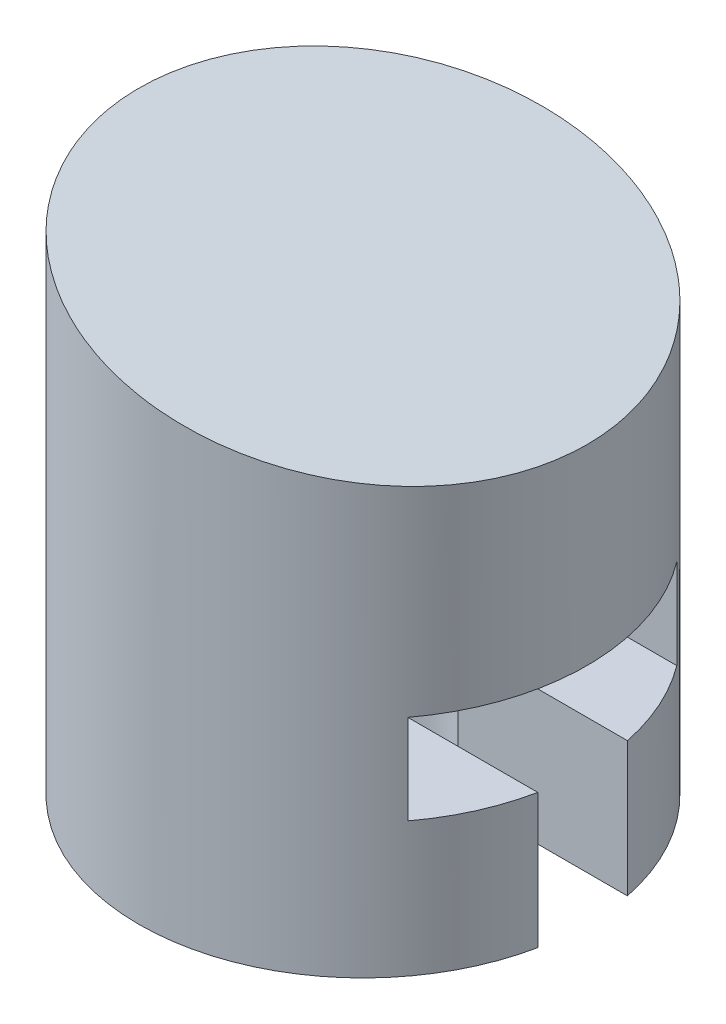
ISO-10303-21;
HEADER;
FILE_DESCRIPTION(('STEP AP214'),'2;1');
FILE_NAME('part.step','',(''),(''),'','','');
FILE_SCHEMA(('AUTOMOTIVE_DESIGN { 1 0 10303 214 1 1 1 1 }'));
ENDSEC;
DATA;
#1=APPLICATION_CONTEXT('core data for automotive mechanical design processes');
#2=APPLICATION_PROTOCOL_DEFINITION('international standard','automotive_design',2000,#1);
#3=PRODUCT_CONTEXT('',#1,'mechanical');
#4=PRODUCT('Part','Part','',(#3));
#5=PRODUCT_RELATED_PRODUCT_CATEGORY('part','',(#4));
#6=PRODUCT_DEFINITION_FORMATION('','',#4);
#7=PRODUCT_DEFINITION_CONTEXT('part definition',#1,'design');
#8=PRODUCT_DEFINITION('design','',#6,#7);
#9=PRODUCT_DEFINITION_SHAPE('','',#8);
#10=(LENGTH_UNIT() NAMED_UNIT(*) SI_UNIT(.MILLI.,.METRE.));
#11=(NAMED_UNIT(*) PLANE_ANGLE_UNIT() SI_UNIT($,.RADIAN.));
#12=(NAMED_UNIT(*) SI_UNIT($,.STERADIAN.) SOLID_ANGLE_UNIT());
#13=UNCERTAINTY_MEASURE_WITH_UNIT(LENGTH_MEASURE(1.E-05),#10,'distance_accuracy_value','');
#14=(GEOMETRIC_REPRESENTATION_CONTEXT(3) GLOBAL_UNCERTAINTY_ASSIGNED_CONTEXT((#13)) GLOBAL_UNIT_ASSIGNED_CONTEXT((#10,
#11,#12)) REPRESENTATION_CONTEXT('',''));
#15=CARTESIAN_POINT('',(0.,0.,0.));
#16=DIRECTION('',(0.,0.,1.));
#17=DIRECTION('',(1.,0.,0.));
#18=AXIS2_PLACEMENT_3D('',#15,#16,#17);
#19=CARTESIAN_POINT('',(62.0070472276326,-3.44598031444264,12.));
#20=DIRECTION('',(0.,1.,0.));
#21=DIRECTION('',(0.,0.,1.));
#22=AXIS2_PLACEMENT_3D('',#19,#20,#21);
#23=CYLINDRICAL_SURFACE('',#22,5.);
#24=CARTESIAN_POINT('',(62.0070472276326,7.22168747182208,17.));
#25=CARTESIAN_POINT('',(61.722556401128,7.27549301161385,16.999988009845));
#26=CARTESIAN_POINT('',(61.4378477151399,7.32927000221098,16.9756453702141));
#27=CARTESIAN_POINT('',(60.8761757344202,7.43520657111893,16.8787830196138));
#28=CARTESIAN_POINT('',(60.5992221817849,7.48736412329567,16.8062053163252));
#29=CARTESIAN_POINT('',(60.0612117571986,7.58853094617125,16.614673684515));
#30=CARTESIAN_POINT('',(59.8001535953893,7.63754047233974,16.4957235247786));
#31=CARTESIAN_POINT('',(59.3016427695895,7.73097156765177,16.2145765548463));
#32=CARTESIAN_POINT('',(59.0641833717945,7.77539444571704,16.0523921302819));
#33=CARTESIAN_POINT('',(58.6217928635087,7.85800868012542,15.6906644761985));
#34=CARTESIAN_POINT('',(58.4166062974767,7.89624904939597,15.4914450626635));
#35=CARTESIAN_POINT('',(58.0426780649608,7.96582287314903,15.0602603995023));
#36=CARTESIAN_POINT('',(57.8739347090468,7.99715664780803,14.8282966686581));
#37=CARTESIAN_POINT('',(57.5806952801721,8.05153327304607,14.342350333871));
#38=CARTESIAN_POINT('',(57.4555100819384,8.07470532863429,14.0887980242486));
#39=CARTESIAN_POINT('',(57.2494874117985,8.11280492796251,13.5636961598051));
#40=CARTESIAN_POINT('',(57.1686457716149,8.12773324661153,13.2921482992494));
#41=CARTESIAN_POINT('',(57.0547439543211,8.14875785106615,12.7430710802692));
#42=CARTESIAN_POINT('',(57.0209970580382,8.15498107476328,12.4656888829542));
#43=CARTESIAN_POINT('',(57.0001240707622,8.15883084846806,11.9091232001494));
#44=CARTESIAN_POINT('',(57.0129954923924,8.15645785713717,11.6299398115579));
#45=CARTESIAN_POINT('',(57.0847024461556,8.14322831583591,11.0796790210209));
#46=CARTESIAN_POINT('',(57.1432268745309,8.13242918591193,10.8085595995688));
#47=CARTESIAN_POINT('',(57.3040429934969,8.10271885608204,10.2801061157671));
#48=CARTESIAN_POINT('',(57.4063348859844,8.08380761875541,10.0227721170151));
#49=CARTESIAN_POINT('',(57.6520197536033,8.03831372146541,9.52810152041983));
#50=CARTESIAN_POINT('',(57.7955620271356,8.01170319286196,9.29084168965339));
#51=CARTESIAN_POINT('',(58.1192962643885,7.95157598575595,8.8438046496195));
#52=CARTESIAN_POINT('',(58.2994902266789,7.91805893064807,8.63402894005194));
#53=CARTESIAN_POINT('',(58.6937637868715,7.8445785418436,8.24502930987128));
#54=CARTESIAN_POINT('',(58.9082414962276,7.8045393520109,8.0662233527594));
#55=CARTESIAN_POINT('',(59.3632251224324,7.71943903234462,7.74706634739932));
#56=CARTESIAN_POINT('',(59.6037332737648,7.67437747137491,7.60671860410732));
#57=CARTESIAN_POINT('',(60.108229383818,7.57969691036311,7.3660070019238));
#58=CARTESIAN_POINT('',(60.3725413527198,7.53001457129355,7.26634704831786));
#59=CARTESIAN_POINT('',(60.9137011233393,7.42813464052047,7.11290331445019));
#60=CARTESIAN_POINT('',(61.1905499522506,7.37593684269306,7.05912330049818));
#61=CARTESIAN_POINT('',(61.7529822668014,7.26974465464294,6.99834628433633));
#62=CARTESIAN_POINT('',(62.0386334525063,7.21573544905748,6.99200017848744));
#63=CARTESIAN_POINT('',(62.6069491458097,7.10815053950076,7.02795860286933));
#64=CARTESIAN_POINT('',(62.889613523219,7.05457485444946,7.07026524502261));
#65=CARTESIAN_POINT('',(63.4452426874685,6.94915748766628,7.20275853006262));
#66=CARTESIAN_POINT('',(63.7181577728965,6.89732475346483,7.29316105295228));
#67=CARTESIAN_POINT('',(64.2450382487981,6.79718190679006,7.5196415061327));
#68=CARTESIAN_POINT('',(64.4990040522941,6.74887171753919,7.65571844053942));
#69=CARTESIAN_POINT('',(64.9787578941104,6.65756143613905,7.96882087612761));
#70=CARTESIAN_POINT('',(65.2047319622883,6.61452630906502,8.14555092768513));
#71=CARTESIAN_POINT('',(65.6237368198458,6.5347009581703,8.53568534224873));
#72=CARTESIAN_POINT('',(65.8167702909967,6.49791022598008,8.74908671691471));
#73=CARTESIAN_POINT('',(66.1611350105506,6.4322624818636,9.20296017187881));
#74=CARTESIAN_POINT('',(66.3130723724636,6.40329017507846,9.44295561697333));
#75=CARTESIAN_POINT('',(66.5744073610442,6.35345145313261,9.94585866690589));
#76=CARTESIAN_POINT('',(66.6838093823472,6.33258420058006,10.2087639013295));
#77=CARTESIAN_POINT('',(66.8550762723268,6.29991520555673,10.7451934695758));
#78=CARTESIAN_POINT('',(66.917720219836,6.28796489101358,11.0184601534014));
#79=CARTESIAN_POINT('',(66.9965143555936,6.27293351216635,11.5718499504779));
#80=CARTESIAN_POINT('',(67.0126678755751,6.26985181229366,11.8519725709476));
#81=CARTESIAN_POINT('',(66.9980483079494,6.27264081579592,12.4079555293909));
#82=CARTESIAN_POINT('',(66.9677714600664,6.27841684925448,12.6838295501623));
#83=CARTESIAN_POINT('',(66.8621629618077,6.29856312970711,13.2264808303685));
#84=CARTESIAN_POINT('',(66.7868318286095,6.31293327804948,13.4932581941864));
#85=CARTESIAN_POINT('',(66.5934067644121,6.34982716735954,14.0103605083407));
#86=CARTESIAN_POINT('',(66.4752924337975,6.37235479792512,14.2606775427794));
#87=CARTESIAN_POINT('',(66.199898796113,6.42487034892825,14.7378625101126));
#88=CARTESIAN_POINT('',(66.0426192681122,6.45485831144953,14.9647303107198));
#89=CARTESIAN_POINT('',(65.6915960425229,6.52176720835663,15.3913489229961));
#90=CARTESIAN_POINT('',(65.4974687502988,6.55876106572585,15.5907725176356));
#91=CARTESIAN_POINT('',(65.0795033070919,6.63837542566025,15.9543343464125));
#92=CARTESIAN_POINT('',(64.8556554187522,6.6809977722622,16.1184609698374));
#93=CARTESIAN_POINT('',(64.3805062803665,6.77141395411099,16.4097297985184));
#94=CARTESIAN_POINT('',(64.1287945753893,6.81928496994663,16.5361776138981));
#95=CARTESIAN_POINT('',(63.6084882624416,6.91815557956897,16.7448712763493));
#96=CARTESIAN_POINT('',(63.3399122074388,6.96915173386313,16.827164779183));
#97=CARTESIAN_POINT('',(62.892654132429,7.05398764542927,16.9241736384367));
#98=CARTESIAN_POINT('',(62.7167271571315,7.08733610885682,16.9525758745023));
#99=CARTESIAN_POINT('',(62.3629109644274,7.1543559276305,16.990492902051));
#100=CARTESIAN_POINT('',(62.1850217270281,7.18802728626602,17.0000075009162));
#101=CARTESIAN_POINT('',(62.0070472276326,7.22168747182208,17.));
#102=B_SPLINE_CURVE_WITH_KNOTS('',3,(#24,#25,#26,#27,#28,#29,#30,#31,#32,#33,#34,#35,#36,#37,
#38,#39,#40,#41,#42,#43,#44,#45,#46,#47,#48,#49,#50,#51,#52,#53,#54,#55,#56,#57,#58,#59,#60,#61,
#62,#63,#64,#65,#66,#67,#68,#69,#70,#71,#72,#73,#74,#75,#76,#77,#78,#79,#80,#81,#82,#83,#84,#85,
#86,#87,#88,#89,#90,#91,#92,#93,#94,#95,#96,#97,#98,#99,#100,#101),.UNSPECIFIED.,.T.,.F.,(4,2,2,
2,2,2,2,2,2,2,2,2,2,2,2,2,2,2,2,2,2,2,2,2,2,2,2,2,2,2,2,2,2,2,2,2,2,2,4),(0.,0.867947513608081,
1.73694044029808,2.60586275685777,3.47453641399343,4.3359444611323,5.1973125666404,
6.04435701018931,6.89132181823318,7.7258026508924,8.56023895947399,9.38903812869437,
10.217841121162,11.0496824353511,11.8815691209468,12.7239307765176,13.5663647988376,
14.4228115015766,15.2793285037377,16.147577572463,17.0158643316379,17.8880817200476,
18.7602800918805,19.6263294882984,20.4923083439314,21.3447163675881,22.1970362993578,
23.0348169028981,23.8725374654573,24.7013668123092,25.5301866452253,26.3594021921506,
27.1886224167868,28.0270022517874,28.8656574460658,29.7189282204526,30.5712761974092,
31.1142495889704,31.657228517795),.UNSPECIFIED.);
#103=CARTESIAN_POINT('',(62.0070472276326,7.22168747182208,17.));
#104=VERTEX_POINT('',#103);
#105=EDGE_CURVE('E161',#104,#104,#102,.T.);
#106=ORIENTED_EDGE('',*,*,#105,.T.);
#107=EDGE_LOOP('',(#106));
#108=FACE_BOUND('',#107,.T.);
#109=CARTESIAN_POINT('',(62.0070472276326,-3.,12.));
#110=DIRECTION('',(0.,1.,0.));
#111=DIRECTION('',(0.,0.,1.));
#112=AXIS2_PLACEMENT_3D('',#109,#110,#111);
#113=CIRCLE('',#112,5.);
#114=CARTESIAN_POINT('',(66.906026713199,-3.,11.));
#115=VERTEX_POINT('',#114);
#116=CARTESIAN_POINT('',(66.906026713199,-3.,13.));
#117=VERTEX_POINT('',#116);
#118=EDGE_CURVE('E158',#115,#117,#113,.T.);
#119=ORIENTED_EDGE('',*,*,#118,.T.);
#120=DIRECTION('',(0.,1.,0.));
#121=VECTOR('',#120,1.);
#122=CARTESIAN_POINT('',(66.906026713199,-3.44598031444264,13.));
#123=LINE('',#122,#121);
#124=CARTESIAN_POINT('',(66.906026713199,0.,13.));
#125=VERTEX_POINT('',#124);
#126=EDGE_CURVE('E244',#117,#125,#123,.T.);
#127=ORIENTED_EDGE('',*,*,#126,.T.);
#128=CARTESIAN_POINT('',(62.0070472276326,0.,12.));
#129=DIRECTION('',(0.,1.,0.));
#130=DIRECTION('',(0.,0.,1.));
#131=AXIS2_PLACEMENT_3D('',#128,#129,#130);
#132=CIRCLE('',#131,5.);
#133=CARTESIAN_POINT('',(66.0070472276326,0.,15.));
#134=VERTEX_POINT('',#133);
#135=EDGE_CURVE('E148',#125,#134,#132,.F.);
#136=ORIENTED_EDGE('',*,*,#135,.T.);
#137=DIRECTION('',(0.,1.,0.));
#138=VECTOR('',#137,1.);
#139=CARTESIAN_POINT('',(66.0070472276326,-3.44598031444264,15.));
#140=LINE('',#139,#138);
#141=CARTESIAN_POINT('',(66.0070472276326,2.,15.));
#142=VERTEX_POINT('',#141);
#143=EDGE_CURVE('E211',#134,#142,#140,.T.);
#144=ORIENTED_EDGE('',*,*,#143,.T.);
#145=CARTESIAN_POINT('',(62.0070472276326,2.,12.));
#146=DIRECTION('',(0.,-1.,0.));
#147=DIRECTION('',(0.,0.,-1.));
#148=AXIS2_PLACEMENT_3D('',#145,#146,#147);
#149=CIRCLE('',#148,5.);
#150=CARTESIAN_POINT('',(66.0070472276326,2.,9.));
#151=VERTEX_POINT('',#150);
#152=EDGE_CURVE('E141',#142,#151,#149,.F.);
#153=ORIENTED_EDGE('',*,*,#152,.T.);
#154=DIRECTION('',(0.,1.,0.));
#155=VECTOR('',#154,1.);
#156=CARTESIAN_POINT('',(66.0070472276326,-3.44598031444264,9.));
#157=LINE('',#156,#155);
#158=CARTESIAN_POINT('',(66.0070472276326,0.,9.));
#159=VERTEX_POINT('',#158);
#160=EDGE_CURVE('E231',#151,#159,#157,.F.);
#161=ORIENTED_EDGE('',*,*,#160,.T.);
#162=CARTESIAN_POINT('',(62.0070472276326,0.,12.));
#163=DIRECTION('',(0.,1.,0.));
#164=DIRECTION('',(0.,0.,1.));
#165=AXIS2_PLACEMENT_3D('',#162,#163,#164);
#166=CIRCLE('',#165,5.);
#167=CARTESIAN_POINT('',(66.906026713199,0.,11.));
#168=VERTEX_POINT('',#167);
#169=EDGE_CURVE('E118',#159,#168,#166,.F.);
#170=ORIENTED_EDGE('',*,*,#169,.T.);
#171=DIRECTION('',(0.,1.,0.));
#172=VECTOR('',#171,1.);
#173=CARTESIAN_POINT('',(66.906026713199,-3.44598031444264,11.));
#174=LINE('',#173,#172);
#175=EDGE_CURVE('E238',#168,#115,#174,.F.);
#176=ORIENTED_EDGE('',*,*,#175,.T.);
#177=EDGE_LOOP('',(#119,#127,#136,#144,#153,#161,#170,#176));
#178=FACE_BOUND('',#177,.T.);
#179=ADVANCED_FACE('F47',(#108,#178),#23,.T.);
#180=CARTESIAN_POINT('',(0.,-3.,0.));
#181=DIRECTION('',(0.,1.,0.));
#182=DIRECTION('',(0.,0.,1.));
#183=AXIS2_PLACEMENT_3D('',#180,#181,#182);
#184=PLANE('',#183);
#185=DIRECTION('',(-1.,0.,0.));
#186=VECTOR('',#185,1.);
#187=CARTESIAN_POINT('',(67.0070472276326,-3.,13.));
#188=LINE('',#187,#186);
#189=CARTESIAN_POINT('',(63.1250812163825,-3.,13.));
#190=VERTEX_POINT('',#189);
#191=EDGE_CURVE('E226',#117,#190,#188,.T.);
#192=ORIENTED_EDGE('',*,*,#191,.F.);
#193=ORIENTED_EDGE('',*,*,#118,.F.);
#194=DIRECTION('',(-1.,0.,0.));
#195=VECTOR('',#194,1.);
#196=CARTESIAN_POINT('',(67.0070472276326,-3.,11.));
#197=LINE('',#196,#195);
#198=CARTESIAN_POINT('',(63.1250812163825,-3.,11.));
#199=VERTEX_POINT('',#198);
#200=EDGE_CURVE('E123',#115,#199,#197,.T.);
#201=ORIENTED_EDGE('',*,*,#200,.T.);
#202=CARTESIAN_POINT('',(62.0070472276326,-3.,12.));
#203=DIRECTION('',(0.,1.,0.));
#204=DIRECTION('',(0.,0.,1.));
#205=AXIS2_PLACEMENT_3D('',#202,#203,#204);
#206=CIRCLE('',#205,1.5);
#207=EDGE_CURVE('E146',#199,#190,#206,.T.);
#208=ORIENTED_EDGE('',*,*,#207,.T.);
#209=EDGE_LOOP('',(#192,#193,#201,#208));
#210=FACE_BOUND('',#209,.T.);
#211=ADVANCED_FACE('F177',(#210),#184,.F.);
#212=CARTESIAN_POINT('',(62.0070472276326,2.,12.));
#213=DIRECTION('',(0.,1.,0.));
#214=DIRECTION('',(0.,0.,1.));
#215=AXIS2_PLACEMENT_3D('',#212,#213,#214);
#216=CYLINDRICAL_SURFACE('',#215,3.);
#217=CARTESIAN_POINT('',(62.0070472276326,0.,12.));
#218=DIRECTION('',(0.,1.,0.));
#219=DIRECTION('',(0.,0.,1.));
#220=AXIS2_PLACEMENT_3D('',#217,#218,#219);
#221=CIRCLE('',#220,3.);
#222=CARTESIAN_POINT('',(62.0070472276326,0.,9.));
#223=VERTEX_POINT('',#222);
#224=CARTESIAN_POINT('',(62.0070472276326,0.,15.));
#225=VERTEX_POINT('',#224);
#226=EDGE_CURVE('E116',#223,#225,#221,.T.);
#227=ORIENTED_EDGE('',*,*,#226,.F.);
#228=DIRECTION('',(0.,1.,0.));
#229=VECTOR('',#228,1.);
#230=CARTESIAN_POINT('',(62.0070472276326,0.,9.));
#231=LINE('',#230,#229);
#232=CARTESIAN_POINT('',(62.0070472276326,2.,9.));
#233=VERTEX_POINT('',#232);
#234=EDGE_CURVE('E127',#223,#233,#231,.T.);
#235=ORIENTED_EDGE('',*,*,#234,.T.);
#236=CARTESIAN_POINT('',(62.0070472276326,2.,12.));
#237=DIRECTION('',(0.,1.,0.));
#238=DIRECTION('',(0.,0.,1.));
#239=AXIS2_PLACEMENT_3D('',#236,#237,#238);
#240=CIRCLE('',#239,3.);
#241=CARTESIAN_POINT('',(62.0070472276326,2.,15.));
#242=VERTEX_POINT('',#241);
#243=EDGE_CURVE('E155',#233,#242,#240,.T.);
#244=ORIENTED_EDGE('',*,*,#243,.T.);
#245=DIRECTION('',(0.,-1.,0.));
#246=VECTOR('',#245,1.);
#247=CARTESIAN_POINT('',(62.0070472276326,0.,15.));
#248=LINE('',#247,#246);
#249=EDGE_CURVE('E134',#242,#225,#248,.T.);
#250=ORIENTED_EDGE('',*,*,#249,.T.);
#251=EDGE_LOOP('',(#227,#235,#244,#250));
#252=FACE_BOUND('',#251,.T.);
#253=ADVANCED_FACE('F137',(#252),#216,.F.);
#254=CARTESIAN_POINT('',(62.0070472276326,2.,12.));
#255=DIRECTION('',(0.,1.,0.));
#256=DIRECTION('',(0.,0.,1.));
#257=AXIS2_PLACEMENT_3D('',#254,#255,#256);
#258=CYLINDRICAL_SURFACE('',#257,1.5);
#259=CARTESIAN_POINT('',(62.0070472276326,0.,12.));
#260=DIRECTION('',(0.,1.,0.));
#261=DIRECTION('',(0.,0.,1.));
#262=AXIS2_PLACEMENT_3D('',#259,#260,#261);
#263=CIRCLE('',#262,1.5);
#264=CARTESIAN_POINT('',(63.1250812163825,0.,11.));
#265=VERTEX_POINT('',#264);
#266=CARTESIAN_POINT('',(63.1250812163825,0.,13.));
#267=VERTEX_POINT('',#266);
#268=EDGE_CURVE('E140',#265,#267,#263,.T.);
#269=ORIENTED_EDGE('',*,*,#268,.T.);
#270=DIRECTION('',(0.,1.,0.));
#271=VECTOR('',#270,1.);
#272=CARTESIAN_POINT('',(63.1250812163825,2.,13.));
#273=LINE('',#272,#271);
#274=EDGE_CURVE('E65',#267,#190,#273,.F.);
#275=ORIENTED_EDGE('',*,*,#274,.T.);
#276=ORIENTED_EDGE('',*,*,#207,.F.);
#277=DIRECTION('',(0.,1.,0.));
#278=VECTOR('',#277,1.);
#279=CARTESIAN_POINT('',(63.1250812163825,2.,11.));
#280=LINE('',#279,#278);
#281=EDGE_CURVE('E234',#199,#265,#280,.T.);
#282=ORIENTED_EDGE('',*,*,#281,.T.);
#283=EDGE_LOOP('',(#269,#275,#276,#282));
#284=FACE_BOUND('',#283,.T.);
#285=ADVANCED_FACE('F184',(#284),#258,.F.);
#286=CARTESIAN_POINT('',(62.0070472276326,0.,0.));
#287=DIRECTION('',(0.,1.,0.));
#288=DIRECTION('',(0.,0.,1.));
#289=AXIS2_PLACEMENT_3D('',#286,#287,#288);
#290=PLANE('',#289);
#291=ORIENTED_EDGE('',*,*,#226,.T.);
#292=DIRECTION('',(-1.,0.,0.));
#293=VECTOR('',#292,1.);
#294=CARTESIAN_POINT('',(67.0070472276326,0.,15.));
#295=LINE('',#294,#293);
#296=EDGE_CURVE('E208',#134,#225,#295,.T.);
#297=ORIENTED_EDGE('',*,*,#296,.F.);
#298=ORIENTED_EDGE('',*,*,#135,.F.);
#299=DIRECTION('',(-1.,0.,0.));
#300=VECTOR('',#299,1.);
#301=CARTESIAN_POINT('',(62.0070472276326,0.,13.));
#302=LINE('',#301,#300);
#303=EDGE_CURVE('E12',#125,#267,#302,.T.);
#304=ORIENTED_EDGE('',*,*,#303,.T.);
#305=ORIENTED_EDGE('',*,*,#268,.F.);
#306=DIRECTION('',(1.,0.,0.));
#307=VECTOR('',#306,1.);
#308=CARTESIAN_POINT('',(62.0070472276326,0.,11.));
#309=LINE('',#308,#307);
#310=EDGE_CURVE('E58',#265,#168,#309,.T.);
#311=ORIENTED_EDGE('',*,*,#310,.T.);
#312=ORIENTED_EDGE('',*,*,#169,.F.);
#313=DIRECTION('',(-1.,0.,0.));
#314=VECTOR('',#313,1.);
#315=CARTESIAN_POINT('',(67.0070472276326,0.,9.));
#316=LINE('',#315,#314);
#317=EDGE_CURVE('E111',#159,#223,#316,.T.);
#318=ORIENTED_EDGE('',*,*,#317,.T.);
#319=EDGE_LOOP('',(#291,#297,#298,#304,#305,#311,#312,#318));
#320=FACE_BOUND('',#319,.T.);
#321=ADVANCED_FACE('F113',(#320),#290,.T.);
#322=CARTESIAN_POINT('',(100.,0.,6.));
#323=CARTESIAN_POINT('',(93.3331168619455,1.26557386191847,6.));
#324=CARTESIAN_POINT('',(83.333766276109,3.16885227616306,6.));
#325=CARTESIAN_POINT('',(69.9993505858364,5.69672158575541,6.));
#326=CARTESIAN_POINT('',(60.0083905950699,7.61115292207959,6.));
#327=CARTESIAN_POINT('',(50.0248149864995,9.44788699290189,6.));
#328=CARTESIAN_POINT('',(40.0304536261938,10.9742714344733,6.));
#329=CARTESIAN_POINT('',(31.6817121650036,11.8575866468183,6.));
#330=CARTESIAN_POINT('',(25.0036831808354,12.2188082758978,6.));
#331=CARTESIAN_POINT('',(19.9912972715788,12.2558988315068,6.));
#332=CARTESIAN_POINT('',(14.9320370707286,11.8315306531659,6.));
#333=CARTESIAN_POINT('',(10.5526533956863,10.7171785821723,6.));
#334=CARTESIAN_POINT('',(7.22610725751978,9.26430075591071,6.));
#335=CARTESIAN_POINT('',(4.89388660656718,7.74081065836544,6.));
#336=CARTESIAN_POINT('',(3.22821222724764,6.30238205119,6.));
#337=CARTESIAN_POINT('',(1.90562399935965,4.78389107983521,6.));
#338=CARTESIAN_POINT('',(0.674372659856759,2.85721534173638,6.));
#339=CARTESIAN_POINT('',(-0.0205231049287246,1.21195926307834,6.));
#340=CARTESIAN_POINT('',(0.,0.,6.));
#341=B_SPLINE_CURVE_WITH_KNOTS('',3,(#322,#323,#324,#325,#326,#327,#328,#329,#330,#331,#332,
#333,#334,#335,#336,#337,#338,#339,#340),.UNSPECIFIED.,.F.,.F.,(4,1,1,1,1,1,1,1,1,1,1,1,1,1,1,1,
4),(0.,0.191317970003105,0.286976955004657,0.382635940006209,0.478123969117518,
0.573153063374082,0.667618396410154,0.714670745410487,0.76165960835572,0.80886449939419,
0.857415615549946,0.888332002110789,0.910749186537599,0.93572410977172,0.950117129082235,
0.96737324121327,1.),.UNSPECIFIED.);
#342=DIRECTION('',(0.,0.,-1.));
#343=VECTOR('',#342,1.);
#344=SURFACE_OF_LINEAR_EXTRUSION('',#341,#343);
#345=ORIENTED_EDGE('',*,*,#105,.F.);
#346=EDGE_LOOP('',(#345));
#347=FACE_BOUND('',#346,.T.);
#348=ADVANCED_FACE('F49',(#347),#344,.F.);
#349=CARTESIAN_POINT('',(62.0070472276326,2.,0.));
#350=DIRECTION('',(0.,-1.,0.));
#351=DIRECTION('',(0.,0.,-1.));
#352=AXIS2_PLACEMENT_3D('',#349,#350,#351);
#353=PLANE('',#352);
#354=ORIENTED_EDGE('',*,*,#243,.F.);
#355=DIRECTION('',(-1.,0.,0.));
#356=VECTOR('',#355,1.);
#357=CARTESIAN_POINT('',(67.0070472276326,2.,9.));
#358=LINE('',#357,#356);
#359=EDGE_CURVE('E124',#151,#233,#358,.T.);
#360=ORIENTED_EDGE('',*,*,#359,.F.);
#361=ORIENTED_EDGE('',*,*,#152,.F.);
#362=DIRECTION('',(-1.,0.,0.));
#363=VECTOR('',#362,1.);
#364=CARTESIAN_POINT('',(67.0070472276326,2.,15.));
#365=LINE('',#364,#363);
#366=EDGE_CURVE('E214',#142,#242,#365,.T.);
#367=ORIENTED_EDGE('',*,*,#366,.T.);
#368=EDGE_LOOP('',(#354,#360,#361,#367));
#369=FACE_BOUND('',#368,.T.);
#370=ADVANCED_FACE('F185',(#369),#353,.T.);
#371=CARTESIAN_POINT('',(67.0070472276326,0.,13.));
#372=DIRECTION('',(0.,0.,-1.));
#373=DIRECTION('',(-1.,0.,0.));
#374=AXIS2_PLACEMENT_3D('',#371,#372,#373);
#375=PLANE('',#374);
#376=ORIENTED_EDGE('',*,*,#191,.T.);
#377=ORIENTED_EDGE('',*,*,#274,.F.);
#378=ORIENTED_EDGE('',*,*,#303,.F.);
#379=ORIENTED_EDGE('',*,*,#126,.F.);
#380=EDGE_LOOP('',(#376,#377,#378,#379));
#381=FACE_BOUND('',#380,.T.);
#382=ADVANCED_FACE('F188',(#381),#375,.T.);
#383=CARTESIAN_POINT('',(67.0070472276326,0.,11.));
#384=DIRECTION('',(0.,0.,1.));
#385=DIRECTION('',(1.,0.,0.));
#386=AXIS2_PLACEMENT_3D('',#383,#384,#385);
#387=PLANE('',#386);
#388=ORIENTED_EDGE('',*,*,#175,.F.);
#389=ORIENTED_EDGE('',*,*,#310,.F.);
#390=ORIENTED_EDGE('',*,*,#281,.F.);
#391=ORIENTED_EDGE('',*,*,#200,.F.);
#392=EDGE_LOOP('',(#388,#389,#390,#391));
#393=FACE_BOUND('',#392,.T.);
#394=ADVANCED_FACE('F197',(#393),#387,.T.);
#395=CARTESIAN_POINT('',(67.0070472276326,0.,9.));
#396=DIRECTION('',(0.,0.,1.));
#397=DIRECTION('',(1.,0.,0.));
#398=AXIS2_PLACEMENT_3D('',#395,#396,#397);
#399=PLANE('',#398);
#400=ORIENTED_EDGE('',*,*,#359,.T.);
#401=ORIENTED_EDGE('',*,*,#234,.F.);
#402=ORIENTED_EDGE('',*,*,#317,.F.);
#403=ORIENTED_EDGE('',*,*,#160,.F.);
#404=EDGE_LOOP('',(#400,#401,#402,#403));
#405=FACE_BOUND('',#404,.T.);
#406=ADVANCED_FACE('F128',(#405),#399,.T.);
#407=CARTESIAN_POINT('',(67.0070472276326,0.,15.));
#408=DIRECTION('',(0.,0.,-1.));
#409=DIRECTION('',(-1.,0.,0.));
#410=AXIS2_PLACEMENT_3D('',#407,#408,#409);
#411=PLANE('',#410);
#412=ORIENTED_EDGE('',*,*,#296,.T.);
#413=ORIENTED_EDGE('',*,*,#249,.F.);
#414=ORIENTED_EDGE('',*,*,#366,.F.);
#415=ORIENTED_EDGE('',*,*,#143,.F.);
#416=EDGE_LOOP('',(#412,#413,#414,#415));
#417=FACE_BOUND('',#416,.T.);
#418=ADVANCED_FACE('F203',(#417),#411,.T.);
#419=CLOSED_SHELL('',(#179,#211,#253,#285,#321,#348,#370,#382,#394,#406,#418));
#420=MANIFOLD_SOLID_BREP('B2',#419);
#421=ADVANCED_BREP_SHAPE_REPRESENTATION('',(#18,#420),#14);
#422=SHAPE_DEFINITION_REPRESENTATION(#9,#421);
ENDSEC;
END-ISO-10303-21;
